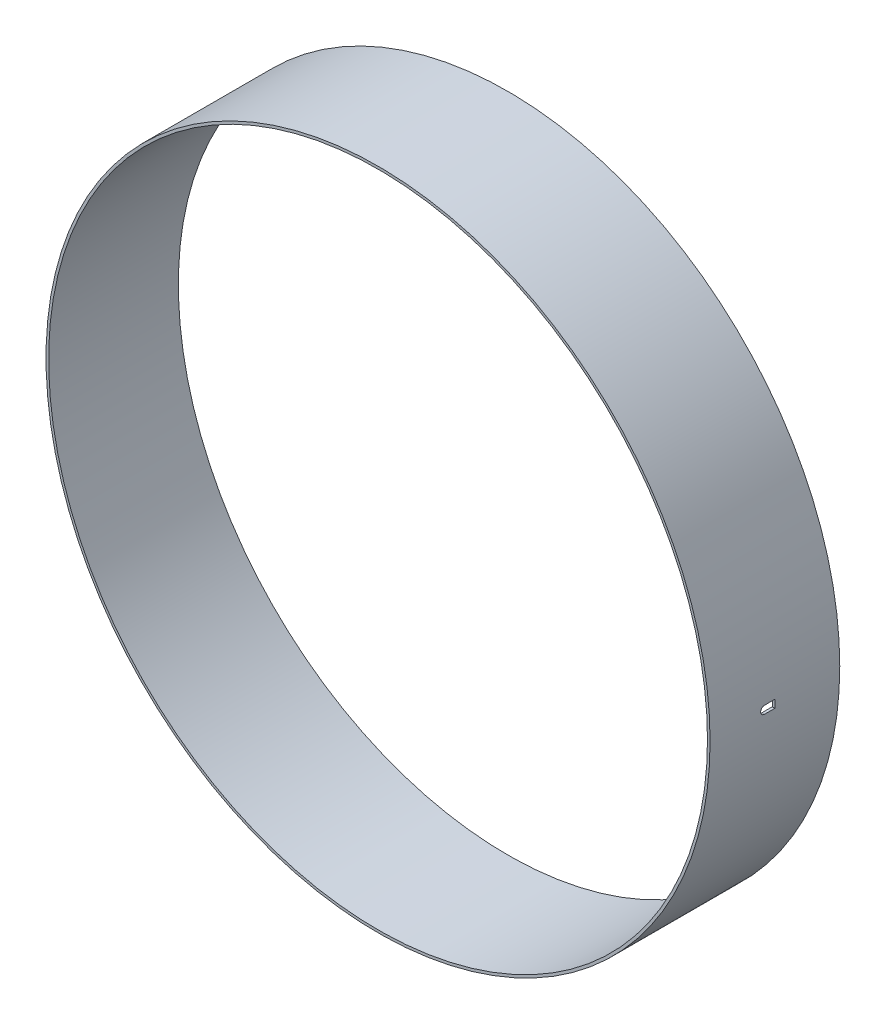
ISO-10303-21;
HEADER;
FILE_DESCRIPTION(('STEP AP214'),'2;1');
FILE_NAME('part.step','',(''),(''),'','','');
FILE_SCHEMA(('AUTOMOTIVE_DESIGN { 1 0 10303 214 1 1 1 1 }'));
ENDSEC;
DATA;
#1=APPLICATION_CONTEXT('core data for automotive mechanical design processes');
#2=APPLICATION_PROTOCOL_DEFINITION('international standard','automotive_design',2000,#1);
#3=PRODUCT_CONTEXT('',#1,'mechanical');
#4=PRODUCT('Part','Part','',(#3));
#5=PRODUCT_RELATED_PRODUCT_CATEGORY('part','',(#4));
#6=PRODUCT_DEFINITION_FORMATION('','',#4);
#7=PRODUCT_DEFINITION_CONTEXT('part definition',#1,'design');
#8=PRODUCT_DEFINITION('design','',#6,#7);
#9=PRODUCT_DEFINITION_SHAPE('','',#8);
#10=(LENGTH_UNIT() NAMED_UNIT(*) SI_UNIT(.MILLI.,.METRE.));
#11=(NAMED_UNIT(*) PLANE_ANGLE_UNIT() SI_UNIT($,.RADIAN.));
#12=(NAMED_UNIT(*) SI_UNIT($,.STERADIAN.) SOLID_ANGLE_UNIT());
#13=UNCERTAINTY_MEASURE_WITH_UNIT(LENGTH_MEASURE(1.E-05),#10,'distance_accuracy_value','');
#14=(GEOMETRIC_REPRESENTATION_CONTEXT(3) GLOBAL_UNCERTAINTY_ASSIGNED_CONTEXT((#13)) GLOBAL_UNIT_ASSIGNED_CONTEXT((#10,
#11,#12)) REPRESENTATION_CONTEXT('',''));
#15=CARTESIAN_POINT('',(0.,0.,0.));
#16=DIRECTION('',(0.,0.,1.));
#17=DIRECTION('',(1.,0.,0.));
#18=AXIS2_PLACEMENT_3D('',#15,#16,#17);
#19=CARTESIAN_POINT('',(0.,0.,25.));
#20=DIRECTION('',(0.,0.,-1.));
#21=DIRECTION('',(-1.,0.,0.));
#22=AXIS2_PLACEMENT_3D('',#19,#20,#21);
#23=CYLINDRICAL_SURFACE('',#22,64.);
#24=CARTESIAN_POINT('',(0.,0.,0.));
#25=DIRECTION('',(0.,0.,1.));
#26=DIRECTION('',(1.,0.,0.));
#27=AXIS2_PLACEMENT_3D('',#24,#25,#26);
#28=CIRCLE('',#27,64.);
#29=CARTESIAN_POINT('',(64.,0.,0.));
#30=VERTEX_POINT('',#29);
#31=EDGE_CURVE('E136',#30,#30,#28,.T.);
#32=ORIENTED_EDGE('',*,*,#31,.T.);
#33=EDGE_LOOP('',(#32));
#34=FACE_BOUND('',#33,.T.);
#35=CARTESIAN_POINT('',(0.,0.,25.));
#36=DIRECTION('',(0.,0.,1.));
#37=DIRECTION('',(1.,0.,0.));
#38=AXIS2_PLACEMENT_3D('',#35,#36,#37);
#39=CIRCLE('',#38,64.);
#40=CARTESIAN_POINT('',(64.,0.,25.));
#41=VERTEX_POINT('',#40);
#42=EDGE_CURVE('E139',#41,#41,#39,.T.);
#43=ORIENTED_EDGE('',*,*,#42,.F.);
#44=EDGE_LOOP('',(#43));
#45=FACE_BOUND('',#44,.T.);
#46=CARTESIAN_POINT('',(63.9956053178654,0.749999999999999,14.5));
#47=CARTESIAN_POINT('',(63.9956037098696,0.750035835942117,14.5421910770075));
#48=CARTESIAN_POINT('',(63.9956469970787,0.746441968559594,14.5843714215498));
#49=CARTESIAN_POINT('',(63.9958114826796,0.732258948323395,14.6675087499764));
#50=CARTESIAN_POINT('',(63.9959326238419,0.721674933697341,14.7084666093731));
#51=CARTESIAN_POINT('',(63.9962410418769,0.693768570284752,14.788040884003));
#52=CARTESIAN_POINT('',(63.996428349344,0.676443103974629,14.8266562063873));
#53=CARTESIAN_POINT('',(63.9968474288403,0.635561316466206,14.9004231573654));
#54=CARTESIAN_POINT('',(63.9970791921771,0.612006213004127,14.9355754610504));
#55=CARTESIAN_POINT('',(63.9975612337378,0.559327317799181,15.0014292132468));
#56=CARTESIAN_POINT('',(63.9978115131609,0.530203165186916,15.0321303731013));
#57=CARTESIAN_POINT('',(63.9983023641379,0.467209642594577,15.088212293629));
#58=CARTESIAN_POINT('',(63.9985429342075,0.43333955065406,15.1135922433615));
#59=CARTESIAN_POINT('',(63.9989872076672,0.361819288781405,15.1583049301819));
#60=CARTESIAN_POINT('',(63.9991909116235,0.324169176929307,15.1776377601651));
#61=CARTESIAN_POINT('',(63.9995384760734,0.246159794660724,15.2097067767733));
#62=CARTESIAN_POINT('',(63.999682340412,0.205800698501665,15.2224433872466));
#63=CARTESIAN_POINT('',(63.9998940231178,0.123517926763101,15.2409599211599));
#64=CARTESIAN_POINT('',(63.9999618434687,0.0815942920255288,15.2467400260672));
#65=CARTESIAN_POINT('',(64.0000137992556,-0.00262935043937894,15.2511800445644));
#66=CARTESIAN_POINT('',(63.9999979327951,-0.0449293666746839,15.249839796791));
#67=CARTESIAN_POINT('',(63.999884302904,-0.128701411472135,15.240077097833));
#68=CARTESIAN_POINT('',(63.9997865443094,-0.17017348877856,15.2316550648495));
#69=CARTESIAN_POINT('',(63.9995201572991,-0.251114901443764,15.2079685291027));
#70=CARTESIAN_POINT('',(63.9993515290966,-0.290584242826735,15.1927040469227));
#71=CARTESIAN_POINT('',(63.9989624013025,-0.366402039513268,15.1557650942976));
#72=CARTESIAN_POINT('',(63.9987418990573,-0.402750335032307,15.1340902959234));
#73=CARTESIAN_POINT('',(63.9982738968681,-0.471290475760222,15.0849473003297));
#74=CARTESIAN_POINT('',(63.9980263982414,-0.503482523632332,15.0574793857612));
#75=CARTESIAN_POINT('',(63.9975323102206,-0.562796477535366,14.997532032022));
#76=CARTESIAN_POINT('',(63.9972857207604,-0.589918759154415,14.9650529644228));
#77=CARTESIAN_POINT('',(63.9968211526899,-0.638334337428008,14.8959896190705));
#78=CARTESIAN_POINT('',(63.9966031831936,-0.659625779586504,14.8594040404471));
#79=CARTESIAN_POINT('',(63.9962204079976,-0.695774218932545,14.7831617899206));
#80=CARTESIAN_POINT('',(63.9960556347582,-0.710627289322739,14.7435032611389));
#81=CARTESIAN_POINT('',(63.9957982663388,-0.733441606037515,14.6622861412113));
#82=CARTESIAN_POINT('',(63.9957055609467,-0.741413377877501,14.6207305546609));
#83=CARTESIAN_POINT('',(63.9956377315346,-0.747229465587877,14.565748912583));
#84=CARTESIAN_POINT('',(63.9956255825901,-0.748268964520423,14.5526090631731));
#85=CARTESIAN_POINT('',(63.9956093866077,-0.749653283235331,14.5263145831028));
#86=CARTESIAN_POINT('',(63.995605326207,-0.749999248782374,14.5131600128046));
#87=CARTESIAN_POINT('',(63.9956053178654,-0.750000000000001,14.5));
#88=B_SPLINE_CURVE_WITH_KNOTS('',3,(#46,#47,#48,#49,#50,#51,#52,#53,#54,#55,#56,#57,#58,#59,#60,
#61,#62,#63,#64,#65,#66,#67,#68,#69,#70,#71,#72,#73,#74,#75,#76,#77,#78,#79,#80,#81,#82,#83,#84,
#85,#86,#87),.UNSPECIFIED.,.F.,.F.,(4,2,2,2,2,2,2,2,2,2,2,2,2,2,2,2,2,2,2,2,4),(0.,
0.126405040814938,0.252717268697454,0.379087978085643,0.505434003436502,0.631788218672794,
0.758161676038905,0.884533191972769,1.010896586741,1.13725668512515,1.2636196471274,
1.38997514753461,1.5163302678443,1.64269185315666,1.76904727460939,1.89539333144472,
2.02177952604463,2.14824269617108,2.27451208590352,2.31404205419671,2.3535066622743),.UNSPECIFIED.);
#89=CARTESIAN_POINT('',(63.9956053178654,0.749999999999999,14.5));
#90=VERTEX_POINT('',#89);
#91=CARTESIAN_POINT('',(63.9956053178654,-0.750000000000001,14.5));
#92=VERTEX_POINT('',#91);
#93=EDGE_CURVE('E91',#90,#92,#88,.T.);
#94=ORIENTED_EDGE('',*,*,#93,.F.);
#95=DIRECTION('',(0.,0.,-1.));
#96=VECTOR('',#95,1.);
#97=CARTESIAN_POINT('',(63.9956053178654,0.749999999999997,25.));
#98=LINE('',#97,#96);
#99=CARTESIAN_POINT('',(63.9956053178654,0.749999999999997,12.5));
#100=VERTEX_POINT('',#99);
#101=EDGE_CURVE('E80',#100,#90,#98,.F.);
#102=ORIENTED_EDGE('',*,*,#101,.F.);
#103=CARTESIAN_POINT('',(0.,0.,12.5));
#104=DIRECTION('',(0.,0.,1.));
#105=DIRECTION('',(1.,0.,0.));
#106=AXIS2_PLACEMENT_3D('',#103,#104,#105);
#107=CIRCLE('',#106,64.);
#108=CARTESIAN_POINT('',(63.9956053178654,-0.750000000000001,12.5));
#109=VERTEX_POINT('',#108);
#110=EDGE_CURVE('E85',#109,#100,#107,.T.);
#111=ORIENTED_EDGE('',*,*,#110,.F.);
#112=DIRECTION('',(0.,0.,-1.));
#113=VECTOR('',#112,1.);
#114=CARTESIAN_POINT('',(63.9956053178654,-0.750000000000001,25.));
#115=LINE('',#114,#113);
#116=EDGE_CURVE('E96',#92,#109,#115,.T.);
#117=ORIENTED_EDGE('',*,*,#116,.F.);
#118=EDGE_LOOP('',(#94,#102,#111,#117));
#119=FACE_BOUND('',#118,.T.);
#120=ADVANCED_FACE('F36',(#34,#45,#119),#23,.T.);
#121=CARTESIAN_POINT('',(0.,0.,25.));
#122=DIRECTION('',(0.,0.,-1.));
#123=DIRECTION('',(-1.,0.,0.));
#124=AXIS2_PLACEMENT_3D('',#121,#122,#123);
#125=CYLINDRICAL_SURFACE('',#124,63.5);
#126=CARTESIAN_POINT('',(0.,0.,25.));
#127=DIRECTION('',(0.,0.,1.));
#128=DIRECTION('',(1.,0.,0.));
#129=AXIS2_PLACEMENT_3D('',#126,#127,#128);
#130=CIRCLE('',#129,63.5);
#131=CARTESIAN_POINT('',(63.5,0.,25.));
#132=VERTEX_POINT('',#131);
#133=EDGE_CURVE('E100',#132,#132,#130,.T.);
#134=ORIENTED_EDGE('',*,*,#133,.T.);
#135=EDGE_LOOP('',(#134));
#136=FACE_BOUND('',#135,.T.);
#137=CARTESIAN_POINT('',(0.,0.,0.));
#138=DIRECTION('',(0.,0.,1.));
#139=DIRECTION('',(1.,0.,0.));
#140=AXIS2_PLACEMENT_3D('',#137,#138,#139);
#141=CIRCLE('',#140,63.5);
#142=CARTESIAN_POINT('',(63.5,0.,0.));
#143=VERTEX_POINT('',#142);
#144=EDGE_CURVE('E97',#143,#143,#141,.T.);
#145=ORIENTED_EDGE('',*,*,#144,.F.);
#146=EDGE_LOOP('',(#145));
#147=FACE_BOUND('',#146,.T.);
#148=DIRECTION('',(0.,0.,-1.));
#149=VECTOR('',#148,1.);
#150=CARTESIAN_POINT('',(63.4955707116646,0.749999999999997,25.));
#151=LINE('',#150,#149);
#152=CARTESIAN_POINT('',(63.4955707116647,0.749999999999999,12.5));
#153=VERTEX_POINT('',#152);
#154=CARTESIAN_POINT('',(63.4955707116646,0.749999999999997,14.5));
#155=VERTEX_POINT('',#154);
#156=EDGE_CURVE('E140',#153,#155,#151,.F.);
#157=ORIENTED_EDGE('',*,*,#156,.T.);
#158=CARTESIAN_POINT('',(63.4955707116646,0.749999999999999,14.5));
#159=CARTESIAN_POINT('',(63.4955690910058,0.750035836051837,14.5421910528964));
#160=CARTESIAN_POINT('',(63.4956127190584,0.746441972648091,14.5843713728113));
#161=CARTESIAN_POINT('',(63.4957784997986,0.732258969571632,14.6675086499747));
#162=CARTESIAN_POINT('',(63.4959005948023,0.72167496843853,14.70846648279));
#163=CARTESIAN_POINT('',(63.4962114412277,0.693768642903057,14.7880407045254));
#164=CARTESIAN_POINT('',(63.4964002234832,0.676443201109353,14.8266560006418));
#165=CARTESIAN_POINT('',(63.4968226026323,0.635561473481933,14.9004229044998));
#166=CARTESIAN_POINT('',(63.4970561907656,0.612006405279076,14.9355751872745));
#167=CARTESIAN_POINT('',(63.4975420278759,0.559327571612713,15.0014289293752));
#168=CARTESIAN_POINT('',(63.497794278074,0.530203441516458,15.0321300970341));
#169=CARTESIAN_POINT('',(63.4982889942095,0.467209962645887,15.0882120387531));
#170=CARTESIAN_POINT('',(63.498531458651,0.433339891911354,15.1135920018738));
#171=CARTESIAN_POINT('',(63.4989792307359,0.361819651276852,15.1583047317004));
#172=CARTESIAN_POINT('',(63.4991845389332,0.324169537736414,15.1776375885496));
#173=CARTESIAN_POINT('',(63.4995348406571,0.246160143040499,15.2097066568461));
#174=CARTESIAN_POINT('',(63.4996798380592,0.205801036155082,15.2224432921711));
#175=CARTESIAN_POINT('',(63.4998931879846,0.123518265762748,15.2409598639638));
#176=CARTESIAN_POINT('',(63.4999615425637,0.0815946442507954,15.2467399870212));
#177=CARTESIAN_POINT('',(63.500013907919,-0.00262897574486348,15.2511800452897));
#178=CARTESIAN_POINT('',(63.4999979167843,-0.0449289827346218,15.2498398191758));
#179=CARTESIAN_POINT('',(63.4998833927526,-0.128700978670359,15.2400771706288));
#180=CARTESIAN_POINT('',(63.4997848647938,-0.170173017001715,15.231655171898));
#181=CARTESIAN_POINT('',(63.4995163811118,-0.251114357473526,15.2079687192999));
#182=CARTESIAN_POINT('',(63.4993464256033,-0.290583665632958,15.1927042859983));
#183=CARTESIAN_POINT('',(63.4989542346685,-0.366401420476897,15.1557654380355));
#184=CARTESIAN_POINT('',(63.4987319965471,-0.402749706145881,15.1340906929183));
#185=CARTESIAN_POINT('',(63.498260309867,-0.471289838672228,15.084947811028));
#186=CARTESIAN_POINT('',(63.498010862636,-0.503481888161457,15.0574799568623));
#187=CARTESIAN_POINT('',(63.4975128840776,-0.562795888771725,14.997532698229));
#188=CARTESIAN_POINT('',(63.4972643526845,-0.589918210657787,14.9650536605622));
#189=CARTESIAN_POINT('',(63.4967961258135,-0.638333874649517,14.8959903654849));
#190=CARTESIAN_POINT('',(63.4965764395211,-0.659625362280235,14.8594048072147));
#191=CARTESIAN_POINT('',(63.4961906492086,-0.695773896029865,14.7831625845149));
#192=CARTESIAN_POINT('',(63.4960245779054,-0.710627015227256,14.7435040631396));
#193=CARTESIAN_POINT('',(63.495765181683,-0.733441428721143,14.6622869456311));
#194=CARTESIAN_POINT('',(63.4956717456842,-0.741413248509775,14.6207313541052));
#195=CARTESIAN_POINT('',(63.4956033812504,-0.747229409924364,14.5657495718904));
#196=CARTESIAN_POINT('',(63.4955911363863,-0.748268929735418,14.552609591173));
#197=CARTESIAN_POINT('',(63.4955748125311,-0.749653276264788,14.5263148475938));
#198=CARTESIAN_POINT('',(63.4955707200717,-0.749999248774339,14.5131601450964));
#199=CARTESIAN_POINT('',(63.4955707116646,-0.750000000000001,14.5));
#200=B_SPLINE_CURVE_WITH_KNOTS('',3,(#158,#159,#160,#161,#162,#163,#164,#165,#166,#167,#168,
#169,#170,#171,#172,#173,#174,#175,#176,#177,#178,#179,#180,#181,#182,#183,#184,#185,#186,#187,
#188,#189,#190,#191,#192,#193,#194,#195,#196,#197,#198,#199),.UNSPECIFIED.,.F.,.F.,(4,2,2,2,2,2,
2,2,2,2,2,2,2,2,2,2,2,2,2,2,4),(0.,0.126404967550325,0.252717116466589,0.379087744463783,
0.505433690531176,0.631787911897898,0.758161375384008,0.884532954951809,1.0108964127886,
1.13725648119248,1.2636194125366,1.38997478412779,1.51632977594989,1.64269128259404,
1.76904662631971,1.89539272566569,2.02177896236933,2.14824217709524,2.27451161181013,
2.31404197750779,2.35350698212947),.UNSPECIFIED.);
#201=CARTESIAN_POINT('',(63.4955707116647,-0.750000000000001,14.5));
#202=VERTEX_POINT('',#201);
#203=EDGE_CURVE('E11',#155,#202,#200,.T.);
#204=ORIENTED_EDGE('',*,*,#203,.T.);
#205=DIRECTION('',(0.,0.,-1.));
#206=VECTOR('',#205,1.);
#207=CARTESIAN_POINT('',(63.4955707116646,-0.750000000000001,25.));
#208=LINE('',#207,#206);
#209=CARTESIAN_POINT('',(63.4955707116646,-0.750000000000001,12.5));
#210=VERTEX_POINT('',#209);
#211=EDGE_CURVE('E50',#202,#210,#208,.T.);
#212=ORIENTED_EDGE('',*,*,#211,.T.);
#213=CARTESIAN_POINT('',(0.,0.,12.5));
#214=DIRECTION('',(0.,0.,1.));
#215=DIRECTION('',(1.,0.,0.));
#216=AXIS2_PLACEMENT_3D('',#213,#214,#215);
#217=CIRCLE('',#216,63.5);
#218=EDGE_CURVE('E142',#210,#153,#217,.T.);
#219=ORIENTED_EDGE('',*,*,#218,.T.);
#220=EDGE_LOOP('',(#157,#204,#212,#219));
#221=FACE_BOUND('',#220,.T.);
#222=ADVANCED_FACE('F115',(#136,#147,#221),#125,.F.);
#223=CARTESIAN_POINT('',(0.,0.,25.));
#224=DIRECTION('',(0.,0.,1.));
#225=DIRECTION('',(1.,0.,0.));
#226=AXIS2_PLACEMENT_3D('',#223,#224,#225);
#227=PLANE('',#226);
#228=ORIENTED_EDGE('',*,*,#42,.T.);
#229=EDGE_LOOP('',(#228));
#230=FACE_BOUND('',#229,.T.);
#231=ORIENTED_EDGE('',*,*,#133,.F.);
#232=EDGE_LOOP('',(#231));
#233=FACE_BOUND('',#232,.T.);
#234=ADVANCED_FACE('F120',(#230,#233),#227,.T.);
#235=CARTESIAN_POINT('',(0.,0.,0.));
#236=DIRECTION('',(0.,0.,1.));
#237=DIRECTION('',(1.,0.,0.));
#238=AXIS2_PLACEMENT_3D('',#235,#236,#237);
#239=PLANE('',#238);
#240=ORIENTED_EDGE('',*,*,#31,.F.);
#241=EDGE_LOOP('',(#240));
#242=FACE_BOUND('',#241,.T.);
#243=ORIENTED_EDGE('',*,*,#144,.T.);
#244=EDGE_LOOP('',(#243));
#245=FACE_BOUND('',#244,.T.);
#246=ADVANCED_FACE('F113',(#242,#245),#239,.F.);
#247=CARTESIAN_POINT('',(2000.,0.,14.5));
#248=DIRECTION('',(-1.,0.,0.));
#249=DIRECTION('',(0.,0.,1.));
#250=AXIS2_PLACEMENT_3D('',#247,#248,#249);
#251=CYLINDRICAL_SURFACE('',#250,0.75);
#252=ORIENTED_EDGE('',*,*,#93,.T.);
#253=DIRECTION('',(-1.,0.,0.));
#254=VECTOR('',#253,1.);
#255=CARTESIAN_POINT('',(2000.,-0.750000000000001,14.5));
#256=LINE('',#255,#254);
#257=EDGE_CURVE('E86',#92,#202,#256,.T.);
#258=ORIENTED_EDGE('',*,*,#257,.T.);
#259=ORIENTED_EDGE('',*,*,#203,.F.);
#260=DIRECTION('',(-1.,0.,0.));
#261=VECTOR('',#260,1.);
#262=CARTESIAN_POINT('',(2000.,0.749999999999999,14.5));
#263=LINE('',#262,#261);
#264=EDGE_CURVE('E62',#90,#155,#263,.T.);
#265=ORIENTED_EDGE('',*,*,#264,.F.);
#266=EDGE_LOOP('',(#252,#258,#259,#265));
#267=FACE_BOUND('',#266,.T.);
#268=ADVANCED_FACE('F89',(#267),#251,.F.);
#269=CARTESIAN_POINT('',(2000.,-0.750000000000001,14.5));
#270=DIRECTION('',(0.,1.,0.));
#271=DIRECTION('',(0.,0.,1.));
#272=AXIS2_PLACEMENT_3D('',#269,#270,#271);
#273=PLANE('',#272);
#274=ORIENTED_EDGE('',*,*,#116,.T.);
#275=DIRECTION('',(-1.,0.,0.));
#276=VECTOR('',#275,1.);
#277=CARTESIAN_POINT('',(2000.,-0.750000000000001,12.5));
#278=LINE('',#277,#276);
#279=EDGE_CURVE('E152',#109,#210,#278,.T.);
#280=ORIENTED_EDGE('',*,*,#279,.T.);
#281=ORIENTED_EDGE('',*,*,#211,.F.);
#282=ORIENTED_EDGE('',*,*,#257,.F.);
#283=EDGE_LOOP('',(#274,#280,#281,#282));
#284=FACE_BOUND('',#283,.T.);
#285=ADVANCED_FACE('F112',(#284),#273,.T.);
#286=CARTESIAN_POINT('',(2000.,-0.750000000000001,12.5));
#287=DIRECTION('',(0.,0.,1.));
#288=DIRECTION('',(1.,0.,0.));
#289=AXIS2_PLACEMENT_3D('',#286,#287,#288);
#290=PLANE('',#289);
#291=ORIENTED_EDGE('',*,*,#110,.T.);
#292=DIRECTION('',(-1.,0.,0.));
#293=VECTOR('',#292,1.);
#294=CARTESIAN_POINT('',(2000.,0.749999999999999,12.5));
#295=LINE('',#294,#293);
#296=EDGE_CURVE('E57',#100,#153,#295,.T.);
#297=ORIENTED_EDGE('',*,*,#296,.T.);
#298=ORIENTED_EDGE('',*,*,#218,.F.);
#299=ORIENTED_EDGE('',*,*,#279,.F.);
#300=EDGE_LOOP('',(#291,#297,#298,#299));
#301=FACE_BOUND('',#300,.T.);
#302=ADVANCED_FACE('F157',(#301),#290,.T.);
#303=CARTESIAN_POINT('',(2000.,0.749999999999999,12.5));
#304=DIRECTION('',(0.,-1.,0.));
#305=DIRECTION('',(0.,0.,-1.));
#306=AXIS2_PLACEMENT_3D('',#303,#304,#305);
#307=PLANE('',#306);
#308=ORIENTED_EDGE('',*,*,#101,.T.);
#309=ORIENTED_EDGE('',*,*,#264,.T.);
#310=ORIENTED_EDGE('',*,*,#156,.F.);
#311=ORIENTED_EDGE('',*,*,#296,.F.);
#312=EDGE_LOOP('',(#308,#309,#310,#311));
#313=FACE_BOUND('',#312,.T.);
#314=ADVANCED_FACE('F81',(#313),#307,.T.);
#315=CLOSED_SHELL('',(#120,#222,#234,#246,#268,#285,#302,#314));
#316=MANIFOLD_SOLID_BREP('B2',#315);
#317=ADVANCED_BREP_SHAPE_REPRESENTATION('',(#18,#316),#14);
#318=SHAPE_DEFINITION_REPRESENTATION(#9,#317);
ENDSEC;
END-ISO-10303-21;
